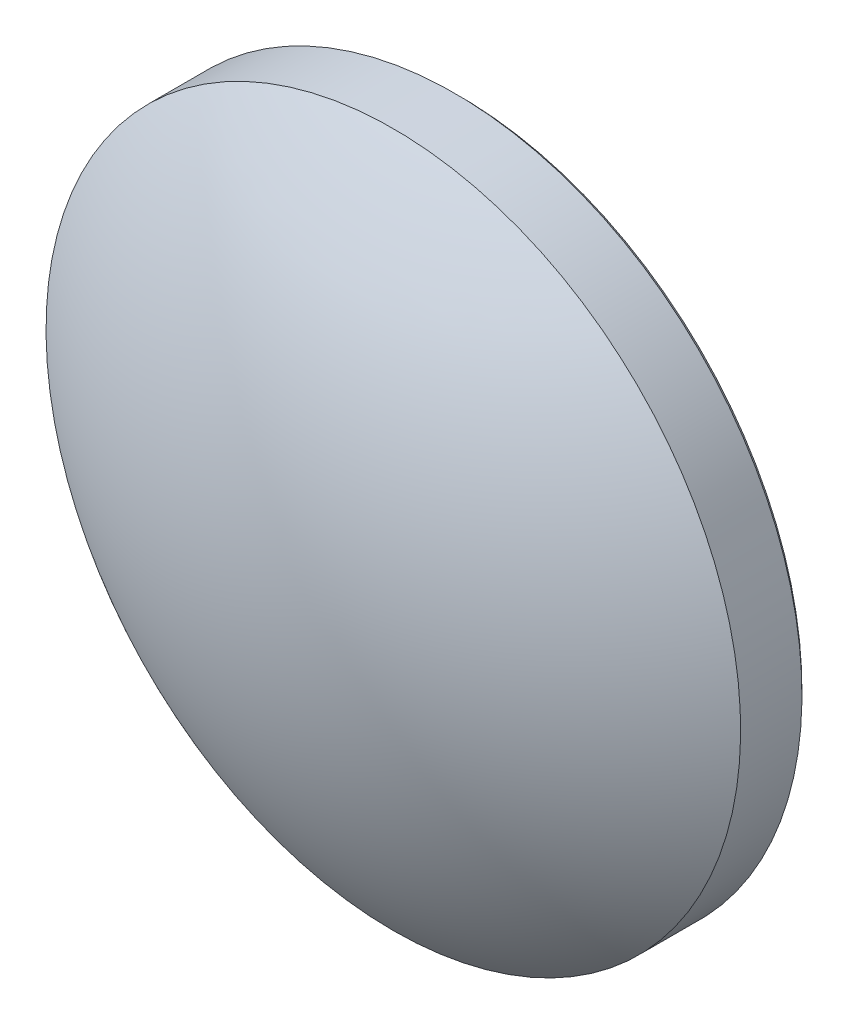
ISO-10303-21;
HEADER;
FILE_DESCRIPTION(('STEP AP214'),'2;1');
FILE_NAME('part.step','',(''),(''),'','','');
FILE_SCHEMA(('AUTOMOTIVE_DESIGN { 1 0 10303 214 1 1 1 1 }'));
ENDSEC;
DATA;
#1=APPLICATION_CONTEXT('core data for automotive mechanical design processes');
#2=APPLICATION_PROTOCOL_DEFINITION('international standard','automotive_design',2000,#1);
#3=PRODUCT_CONTEXT('',#1,'mechanical');
#4=PRODUCT('Part','Part','',(#3));
#5=PRODUCT_RELATED_PRODUCT_CATEGORY('part','',(#4));
#6=PRODUCT_DEFINITION_FORMATION('','',#4);
#7=PRODUCT_DEFINITION_CONTEXT('part definition',#1,'design');
#8=PRODUCT_DEFINITION('design','',#6,#7);
#9=PRODUCT_DEFINITION_SHAPE('','',#8);
#10=(LENGTH_UNIT() NAMED_UNIT(*) SI_UNIT(.MILLI.,.METRE.));
#11=(NAMED_UNIT(*) PLANE_ANGLE_UNIT() SI_UNIT($,.RADIAN.));
#12=(NAMED_UNIT(*) SI_UNIT($,.STERADIAN.) SOLID_ANGLE_UNIT());
#13=UNCERTAINTY_MEASURE_WITH_UNIT(LENGTH_MEASURE(1.E-05),#10,'distance_accuracy_value','');
#14=(GEOMETRIC_REPRESENTATION_CONTEXT(3) GLOBAL_UNCERTAINTY_ASSIGNED_CONTEXT((#13)) GLOBAL_UNIT_ASSIGNED_CONTEXT((#10,
#11,#12)) REPRESENTATION_CONTEXT('',''));
#15=CARTESIAN_POINT('',(0.,0.,0.));
#16=DIRECTION('',(0.,0.,1.));
#17=DIRECTION('',(1.,0.,0.));
#18=AXIS2_PLACEMENT_3D('',#15,#16,#17);
#19=CARTESIAN_POINT('',(0.,15.,24.39));
#20=DIRECTION('',(0.,0.,1.));
#21=DIRECTION('',(0.,-1.,0.));
#22=AXIS2_PLACEMENT_3D('',#19,#20,#21);
#23=PLANE('',#22);
#24=CARTESIAN_POINT('',(0.,0.,24.39));
#25=DIRECTION('',(0.,0.,1.));
#26=DIRECTION('',(0.,-1.,0.));
#27=AXIS2_PLACEMENT_3D('',#24,#25,#26);
#28=CIRCLE('',#27,11.4540822417163);
#29=CARTESIAN_POINT('',(0.,11.4540822417163,24.39));
#30=VERTEX_POINT('',#29);
#31=EDGE_CURVE('E11',#30,#30,#28,.T.);
#32=ORIENTED_EDGE('',*,*,#31,.T.);
#33=EDGE_LOOP('',(#32));
#34=FACE_BOUND('',#33,.T.);
#35=CARTESIAN_POINT('',(0.,0.,24.39));
#36=DIRECTION('',(0.,0.,-1.));
#37=DIRECTION('',(0.,-1.,0.));
#38=AXIS2_PLACEMENT_3D('',#35,#36,#37);
#39=CIRCLE('',#38,14.8);
#40=CARTESIAN_POINT('',(0.,-14.8,24.39));
#41=VERTEX_POINT('',#40);
#42=EDGE_CURVE('E47',#41,#41,#39,.T.);
#43=ORIENTED_EDGE('',*,*,#42,.T.);
#44=EDGE_LOOP('',(#43));
#45=FACE_BOUND('',#44,.T.);
#46=ADVANCED_FACE('F16',(#34,#45),#23,.F.);
#47=CARTESIAN_POINT('',(0.,0.,6.99));
#48=DIRECTION('',(-1.,0.,0.));
#49=DIRECTION('',(0.,1.,0.));
#50=AXIS2_PLACEMENT_3D('',#47,#48,#49);
#51=SPHERICAL_SURFACE('',#50,25.2);
#52=CARTESIAN_POINT('',(0.,0.,6.99));
#53=DIRECTION('',(0.,0.,1.));
#54=DIRECTION('',(0.,-1.,0.));
#55=AXIS2_PLACEMENT_3D('',#52,#53,#54);
#56=SPHERICAL_SURFACE('',#55,25.2);
#57=CARTESIAN_POINT('',(0.,0.,27.2394444368235));
#58=DIRECTION('',(0.,0.,1.));
#59=DIRECTION('',(0.,-1.,0.));
#60=AXIS2_PLACEMENT_3D('',#57,#58,#59);
#61=CIRCLE('',#60,15.);
#62=CARTESIAN_POINT('',(0.,-15.,27.2394444368235));
#63=VERTEX_POINT('',#62);
#64=EDGE_CURVE('E26',#63,#63,#61,.T.);
#65=ORIENTED_EDGE('',*,*,#64,.T.);
#66=EDGE_LOOP('',(#65));
#67=FACE_BOUND('',#66,.T.);
#68=ADVANCED_FACE('F84',(#67),#56,.T.);
#69=CARTESIAN_POINT('',(0.,0.,15.98));
#70=DIRECTION('',(-1.,0.,0.));
#71=DIRECTION('',(0.,1.,0.));
#72=AXIS2_PLACEMENT_3D('',#69,#70,#71);
#73=SPHERICAL_SURFACE('',#72,14.21);
#74=CARTESIAN_POINT('',(0.,0.,15.98));
#75=DIRECTION('',(0.,0.,1.));
#76=DIRECTION('',(0.,-1.,0.));
#77=AXIS2_PLACEMENT_3D('',#74,#75,#76);
#78=SPHERICAL_SURFACE('',#77,14.21);
#79=ORIENTED_EDGE('',*,*,#31,.F.);
#80=EDGE_LOOP('',(#79));
#81=FACE_BOUND('',#80,.T.);
#82=ADVANCED_FACE('F89',(#81),#78,.F.);
#83=CARTESIAN_POINT('',(0.,0.,32.19));
#84=DIRECTION('',(0.,0.,1.));
#85=DIRECTION('',(0.,-1.,0.));
#86=AXIS2_PLACEMENT_3D('',#83,#84,#85);
#87=CYLINDRICAL_SURFACE('',#86,15.);
#88=ORIENTED_EDGE('',*,*,#64,.F.);
#89=EDGE_LOOP('',(#88));
#90=FACE_BOUND('',#89,.T.);
#91=CARTESIAN_POINT('',(0.,0.,24.59));
#92=DIRECTION('',(0.,0.,1.));
#93=DIRECTION('',(0.,-1.,0.));
#94=AXIS2_PLACEMENT_3D('',#91,#92,#93);
#95=CIRCLE('',#94,15.);
#96=CARTESIAN_POINT('',(0.,-15.,24.59));
#97=VERTEX_POINT('',#96);
#98=EDGE_CURVE('E54',#97,#97,#95,.T.);
#99=ORIENTED_EDGE('',*,*,#98,.T.);
#100=EDGE_LOOP('',(#99));
#101=FACE_BOUND('',#100,.T.);
#102=ADVANCED_FACE('F55',(#90,#101),#87,.T.);
#103=CARTESIAN_POINT('',(0.,0.,24.59));
#104=DIRECTION('',(0.,0.,1.));
#105=DIRECTION('',(0.,-1.,0.));
#106=AXIS2_PLACEMENT_3D('',#103,#104,#105);
#107=CONICAL_SURFACE('',#106,15.,0.785398163397448);
#108=ORIENTED_EDGE('',*,*,#98,.F.);
#109=EDGE_LOOP('',(#108));
#110=FACE_BOUND('',#109,.T.);
#111=ORIENTED_EDGE('',*,*,#42,.F.);
#112=EDGE_LOOP('',(#111));
#113=FACE_BOUND('',#112,.T.);
#114=ADVANCED_FACE('F18',(#110,#113),#107,.T.);
#115=CLOSED_SHELL('',(#46,#68,#82,#102,#114));
#116=MANIFOLD_SOLID_BREP('B1',#115);
#117=ADVANCED_BREP_SHAPE_REPRESENTATION('',(#18,#116),#14);
#118=SHAPE_DEFINITION_REPRESENTATION(#9,#117);
ENDSEC;
END-ISO-10303-21;
